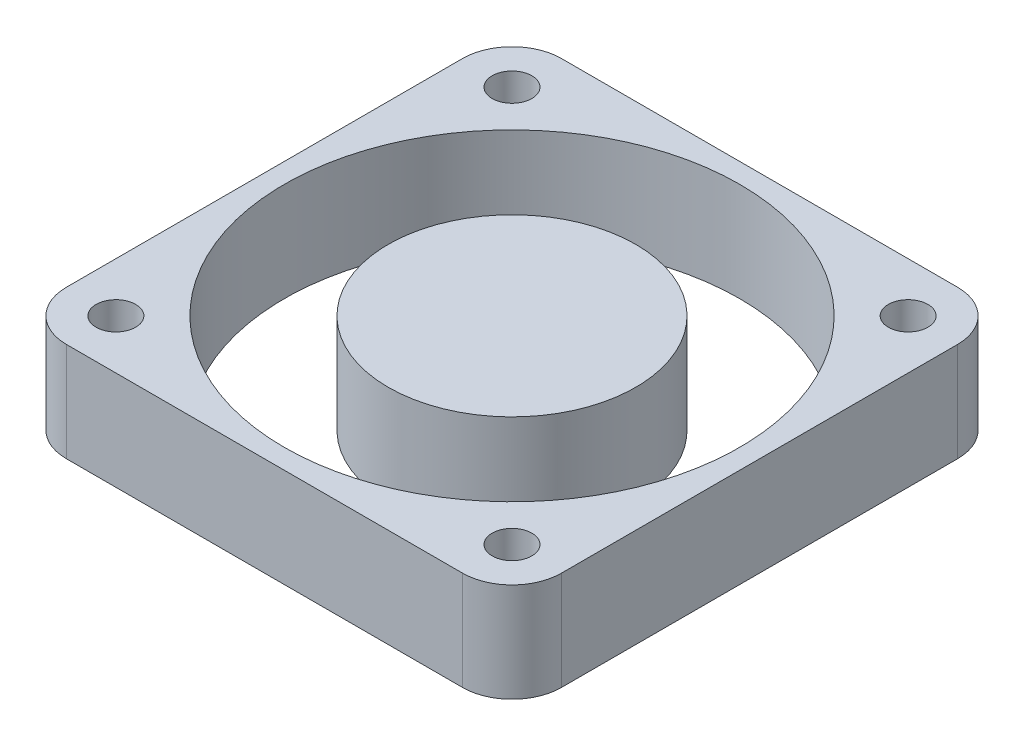
ISO-10303-21;
HEADER;
FILE_DESCRIPTION(('STEP AP214'),'2;1');
FILE_NAME('part.step','',(''),(''),'','','');
FILE_SCHEMA(('AUTOMOTIVE_DESIGN { 1 0 10303 214 1 1 1 1 }'));
ENDSEC;
DATA;
#1=APPLICATION_CONTEXT('core data for automotive mechanical design processes');
#2=APPLICATION_PROTOCOL_DEFINITION('international standard','automotive_design',2000,#1);
#3=PRODUCT_CONTEXT('',#1,'mechanical');
#4=PRODUCT('Part','Part','',(#3));
#5=PRODUCT_RELATED_PRODUCT_CATEGORY('part','',(#4));
#6=PRODUCT_DEFINITION_FORMATION('','',#4);
#7=PRODUCT_DEFINITION_CONTEXT('part definition',#1,'design');
#8=PRODUCT_DEFINITION('design','',#6,#7);
#9=PRODUCT_DEFINITION_SHAPE('','',#8);
#10=(LENGTH_UNIT() NAMED_UNIT(*) SI_UNIT(.MILLI.,.METRE.));
#11=(NAMED_UNIT(*) PLANE_ANGLE_UNIT() SI_UNIT($,.RADIAN.));
#12=(NAMED_UNIT(*) SI_UNIT($,.STERADIAN.) SOLID_ANGLE_UNIT());
#13=UNCERTAINTY_MEASURE_WITH_UNIT(LENGTH_MEASURE(1.E-05),#10,'distance_accuracy_value','');
#14=(GEOMETRIC_REPRESENTATION_CONTEXT(3) GLOBAL_UNCERTAINTY_ASSIGNED_CONTEXT((#13)) GLOBAL_UNIT_ASSIGNED_CONTEXT((#10,
#11,#12)) REPRESENTATION_CONTEXT('',''));
#15=CARTESIAN_POINT('',(0.,0.,0.));
#16=DIRECTION('',(0.,0.,1.));
#17=DIRECTION('',(1.,0.,0.));
#18=AXIS2_PLACEMENT_3D('',#15,#16,#17);
#19=CARTESIAN_POINT('',(20.,10.,-20.));
#20=DIRECTION('',(0.,-1.,0.));
#21=DIRECTION('',(0.,0.,-1.));
#22=AXIS2_PLACEMENT_3D('',#19,#20,#21);
#23=CYLINDRICAL_SURFACE('',#22,5.);
#24=CARTESIAN_POINT('',(20.,0.,-20.));
#25=DIRECTION('',(0.,1.,0.));
#26=DIRECTION('',(0.,0.,1.));
#27=AXIS2_PLACEMENT_3D('',#24,#25,#26);
#28=CIRCLE('',#27,5.);
#29=CARTESIAN_POINT('',(25.,0.,-20.));
#30=VERTEX_POINT('',#29);
#31=CARTESIAN_POINT('',(20.,0.,-25.));
#32=VERTEX_POINT('',#31);
#33=EDGE_CURVE('E137',#30,#32,#28,.T.);
#34=ORIENTED_EDGE('',*,*,#33,.T.);
#35=DIRECTION('',(0.,-1.,0.));
#36=VECTOR('',#35,1.);
#37=CARTESIAN_POINT('',(20.,10.,-25.));
#38=LINE('',#37,#36);
#39=CARTESIAN_POINT('',(20.,10.,-25.));
#40=VERTEX_POINT('',#39);
#41=EDGE_CURVE('E121',#40,#32,#38,.T.);
#42=ORIENTED_EDGE('',*,*,#41,.F.);
#43=CARTESIAN_POINT('',(20.,10.,-20.));
#44=DIRECTION('',(0.,1.,0.));
#45=DIRECTION('',(0.,0.,1.));
#46=AXIS2_PLACEMENT_3D('',#43,#44,#45);
#47=CIRCLE('',#46,5.);
#48=CARTESIAN_POINT('',(25.,10.,-20.));
#49=VERTEX_POINT('',#48);
#50=EDGE_CURVE('E45',#49,#40,#47,.T.);
#51=ORIENTED_EDGE('',*,*,#50,.F.);
#52=DIRECTION('',(0.,-1.,0.));
#53=VECTOR('',#52,1.);
#54=CARTESIAN_POINT('',(25.,10.,-20.));
#55=LINE('',#54,#53);
#56=EDGE_CURVE('E123',#49,#30,#55,.T.);
#57=ORIENTED_EDGE('',*,*,#56,.T.);
#58=EDGE_LOOP('',(#34,#42,#51,#57));
#59=FACE_BOUND('',#58,.T.);
#60=ADVANCED_FACE('F41',(#59),#23,.T.);
#61=CARTESIAN_POINT('',(-20.,10.,-25.));
#62=DIRECTION('',(0.,0.,1.));
#63=DIRECTION('',(1.,0.,0.));
#64=AXIS2_PLACEMENT_3D('',#61,#62,#63);
#65=PLANE('',#64);
#66=DIRECTION('',(-1.,0.,0.));
#67=VECTOR('',#66,1.);
#68=CARTESIAN_POINT('',(-20.,0.,-25.));
#69=LINE('',#68,#67);
#70=CARTESIAN_POINT('',(-20.,0.,-25.));
#71=VERTEX_POINT('',#70);
#72=EDGE_CURVE('E60',#32,#71,#69,.T.);
#73=ORIENTED_EDGE('',*,*,#72,.T.);
#74=DIRECTION('',(0.,-1.,0.));
#75=VECTOR('',#74,1.);
#76=CARTESIAN_POINT('',(-20.,10.,-25.));
#77=LINE('',#76,#75);
#78=CARTESIAN_POINT('',(-20.,10.,-25.));
#79=VERTEX_POINT('',#78);
#80=EDGE_CURVE('E118',#79,#71,#77,.T.);
#81=ORIENTED_EDGE('',*,*,#80,.F.);
#82=DIRECTION('',(-1.,0.,0.));
#83=VECTOR('',#82,1.);
#84=CARTESIAN_POINT('',(-20.,10.,-25.));
#85=LINE('',#84,#83);
#86=EDGE_CURVE('E87',#40,#79,#85,.T.);
#87=ORIENTED_EDGE('',*,*,#86,.F.);
#88=ORIENTED_EDGE('',*,*,#41,.T.);
#89=EDGE_LOOP('',(#73,#81,#87,#88));
#90=FACE_BOUND('',#89,.T.);
#91=ADVANCED_FACE('F117',(#90),#65,.F.);
#92=CARTESIAN_POINT('',(-20.,10.,-20.));
#93=DIRECTION('',(0.,-1.,0.));
#94=DIRECTION('',(0.,0.,-1.));
#95=AXIS2_PLACEMENT_3D('',#92,#93,#94);
#96=CYLINDRICAL_SURFACE('',#95,5.);
#97=CARTESIAN_POINT('',(-20.,0.,-20.));
#98=DIRECTION('',(0.,1.,0.));
#99=DIRECTION('',(0.,0.,-1.));
#100=AXIS2_PLACEMENT_3D('',#97,#98,#99);
#101=CIRCLE('',#100,5.);
#102=CARTESIAN_POINT('',(-25.,0.,-20.));
#103=VERTEX_POINT('',#102);
#104=EDGE_CURVE('E114',#71,#103,#101,.T.);
#105=ORIENTED_EDGE('',*,*,#104,.T.);
#106=DIRECTION('',(0.,-1.,0.));
#107=VECTOR('',#106,1.);
#108=CARTESIAN_POINT('',(-25.,10.,-20.));
#109=LINE('',#108,#107);
#110=CARTESIAN_POINT('',(-25.,10.,-20.));
#111=VERTEX_POINT('',#110);
#112=EDGE_CURVE('E164',#111,#103,#109,.T.);
#113=ORIENTED_EDGE('',*,*,#112,.F.);
#114=CARTESIAN_POINT('',(-20.,10.,-20.));
#115=DIRECTION('',(0.,1.,0.));
#116=DIRECTION('',(0.,0.,-1.));
#117=AXIS2_PLACEMENT_3D('',#114,#115,#116);
#118=CIRCLE('',#117,5.);
#119=EDGE_CURVE('E126',#79,#111,#118,.T.);
#120=ORIENTED_EDGE('',*,*,#119,.F.);
#121=ORIENTED_EDGE('',*,*,#80,.T.);
#122=EDGE_LOOP('',(#105,#113,#120,#121));
#123=FACE_BOUND('',#122,.T.);
#124=ADVANCED_FACE('F125',(#123),#96,.T.);
#125=CARTESIAN_POINT('',(-25.,10.,-20.));
#126=DIRECTION('',(1.,0.,0.));
#127=DIRECTION('',(0.,0.,-1.));
#128=AXIS2_PLACEMENT_3D('',#125,#126,#127);
#129=PLANE('',#128);
#130=DIRECTION('',(0.,0.,1.));
#131=VECTOR('',#130,1.);
#132=CARTESIAN_POINT('',(-25.,0.,-20.));
#133=LINE('',#132,#131);
#134=CARTESIAN_POINT('',(-25.,0.,20.));
#135=VERTEX_POINT('',#134);
#136=EDGE_CURVE('E127',#103,#135,#133,.T.);
#137=ORIENTED_EDGE('',*,*,#136,.T.);
#138=DIRECTION('',(0.,-1.,0.));
#139=VECTOR('',#138,1.);
#140=CARTESIAN_POINT('',(-25.,10.,20.));
#141=LINE('',#140,#139);
#142=CARTESIAN_POINT('',(-25.,10.,20.));
#143=VERTEX_POINT('',#142);
#144=EDGE_CURVE('E162',#143,#135,#141,.T.);
#145=ORIENTED_EDGE('',*,*,#144,.F.);
#146=DIRECTION('',(0.,0.,1.));
#147=VECTOR('',#146,1.);
#148=CARTESIAN_POINT('',(-25.,10.,-20.));
#149=LINE('',#148,#147);
#150=EDGE_CURVE('E145',#111,#143,#149,.T.);
#151=ORIENTED_EDGE('',*,*,#150,.F.);
#152=ORIENTED_EDGE('',*,*,#112,.T.);
#153=EDGE_LOOP('',(#137,#145,#151,#152));
#154=FACE_BOUND('',#153,.T.);
#155=ADVANCED_FACE('F186',(#154),#129,.F.);
#156=CARTESIAN_POINT('',(-20.,10.,20.));
#157=DIRECTION('',(0.,-1.,0.));
#158=DIRECTION('',(0.,0.,-1.));
#159=AXIS2_PLACEMENT_3D('',#156,#157,#158);
#160=CYLINDRICAL_SURFACE('',#159,5.);
#161=CARTESIAN_POINT('',(-20.,0.,20.));
#162=DIRECTION('',(0.,1.,0.));
#163=DIRECTION('',(0.,0.,-1.));
#164=AXIS2_PLACEMENT_3D('',#161,#162,#163);
#165=CIRCLE('',#164,5.);
#166=CARTESIAN_POINT('',(-20.,0.,25.));
#167=VERTEX_POINT('',#166);
#168=EDGE_CURVE('E163',#135,#167,#165,.T.);
#169=ORIENTED_EDGE('',*,*,#168,.T.);
#170=DIRECTION('',(0.,-1.,0.));
#171=VECTOR('',#170,1.);
#172=CARTESIAN_POINT('',(-20.,10.,25.));
#173=LINE('',#172,#171);
#174=CARTESIAN_POINT('',(-20.,10.,25.));
#175=VERTEX_POINT('',#174);
#176=EDGE_CURVE('E160',#175,#167,#173,.T.);
#177=ORIENTED_EDGE('',*,*,#176,.F.);
#178=CARTESIAN_POINT('',(-20.,10.,20.));
#179=DIRECTION('',(0.,1.,0.));
#180=DIRECTION('',(0.,0.,-1.));
#181=AXIS2_PLACEMENT_3D('',#178,#179,#180);
#182=CIRCLE('',#181,5.);
#183=EDGE_CURVE('E143',#143,#175,#182,.T.);
#184=ORIENTED_EDGE('',*,*,#183,.F.);
#185=ORIENTED_EDGE('',*,*,#144,.T.);
#186=EDGE_LOOP('',(#169,#177,#184,#185));
#187=FACE_BOUND('',#186,.T.);
#188=ADVANCED_FACE('F185',(#187),#160,.T.);
#189=CARTESIAN_POINT('',(-20.,10.,25.));
#190=DIRECTION('',(0.,0.,-1.));
#191=DIRECTION('',(-1.,0.,0.));
#192=AXIS2_PLACEMENT_3D('',#189,#190,#191);
#193=PLANE('',#192);
#194=DIRECTION('',(1.,0.,0.));
#195=VECTOR('',#194,1.);
#196=CARTESIAN_POINT('',(-20.,0.,25.));
#197=LINE('',#196,#195);
#198=CARTESIAN_POINT('',(20.,0.,25.));
#199=VERTEX_POINT('',#198);
#200=EDGE_CURVE('E161',#167,#199,#197,.T.);
#201=ORIENTED_EDGE('',*,*,#200,.T.);
#202=DIRECTION('',(0.,-1.,0.));
#203=VECTOR('',#202,1.);
#204=CARTESIAN_POINT('',(20.,10.,25.));
#205=LINE('',#204,#203);
#206=CARTESIAN_POINT('',(20.,10.,25.));
#207=VERTEX_POINT('',#206);
#208=EDGE_CURVE('E152',#207,#199,#205,.T.);
#209=ORIENTED_EDGE('',*,*,#208,.F.);
#210=DIRECTION('',(1.,0.,0.));
#211=VECTOR('',#210,1.);
#212=CARTESIAN_POINT('',(-20.,10.,25.));
#213=LINE('',#212,#211);
#214=EDGE_CURVE('E141',#175,#207,#213,.T.);
#215=ORIENTED_EDGE('',*,*,#214,.F.);
#216=ORIENTED_EDGE('',*,*,#176,.T.);
#217=EDGE_LOOP('',(#201,#209,#215,#216));
#218=FACE_BOUND('',#217,.T.);
#219=ADVANCED_FACE('F176',(#218),#193,.F.);
#220=CARTESIAN_POINT('',(20.,10.,20.));
#221=DIRECTION('',(0.,-1.,0.));
#222=DIRECTION('',(0.,0.,-1.));
#223=AXIS2_PLACEMENT_3D('',#220,#221,#222);
#224=CYLINDRICAL_SURFACE('',#223,5.);
#225=CARTESIAN_POINT('',(20.,0.,20.));
#226=DIRECTION('',(0.,1.,0.));
#227=DIRECTION('',(0.,0.,-1.));
#228=AXIS2_PLACEMENT_3D('',#225,#226,#227);
#229=CIRCLE('',#228,5.);
#230=CARTESIAN_POINT('',(25.,0.,20.));
#231=VERTEX_POINT('',#230);
#232=EDGE_CURVE('E158',#199,#231,#229,.T.);
#233=ORIENTED_EDGE('',*,*,#232,.T.);
#234=DIRECTION('',(0.,-1.,0.));
#235=VECTOR('',#234,1.);
#236=CARTESIAN_POINT('',(25.,10.,20.));
#237=LINE('',#236,#235);
#238=CARTESIAN_POINT('',(25.,10.,20.));
#239=VERTEX_POINT('',#238);
#240=EDGE_CURVE('E147',#239,#231,#237,.T.);
#241=ORIENTED_EDGE('',*,*,#240,.F.);
#242=CARTESIAN_POINT('',(20.,10.,20.));
#243=DIRECTION('',(0.,1.,0.));
#244=DIRECTION('',(0.,0.,-1.));
#245=AXIS2_PLACEMENT_3D('',#242,#243,#244);
#246=CIRCLE('',#245,5.);
#247=EDGE_CURVE('E51',#207,#239,#246,.T.);
#248=ORIENTED_EDGE('',*,*,#247,.F.);
#249=ORIENTED_EDGE('',*,*,#208,.T.);
#250=EDGE_LOOP('',(#233,#241,#248,#249));
#251=FACE_BOUND('',#250,.T.);
#252=ADVANCED_FACE('F182',(#251),#224,.T.);
#253=CARTESIAN_POINT('',(25.,10.,-20.));
#254=DIRECTION('',(-1.,0.,0.));
#255=DIRECTION('',(0.,0.,1.));
#256=AXIS2_PLACEMENT_3D('',#253,#254,#255);
#257=PLANE('',#256);
#258=DIRECTION('',(0.,0.,-1.));
#259=VECTOR('',#258,1.);
#260=CARTESIAN_POINT('',(25.,0.,-20.));
#261=LINE('',#260,#259);
#262=EDGE_CURVE('E96',#231,#30,#261,.T.);
#263=ORIENTED_EDGE('',*,*,#262,.T.);
#264=ORIENTED_EDGE('',*,*,#56,.F.);
#265=DIRECTION('',(0.,0.,-1.));
#266=VECTOR('',#265,1.);
#267=CARTESIAN_POINT('',(25.,10.,-20.));
#268=LINE('',#267,#266);
#269=EDGE_CURVE('E12',#239,#49,#268,.T.);
#270=ORIENTED_EDGE('',*,*,#269,.F.);
#271=ORIENTED_EDGE('',*,*,#240,.T.);
#272=EDGE_LOOP('',(#263,#264,#270,#271));
#273=FACE_BOUND('',#272,.T.);
#274=ADVANCED_FACE('F265',(#273),#257,.F.);
#275=CARTESIAN_POINT('',(20.,10.,-20.));
#276=DIRECTION('',(0.,1.,0.));
#277=DIRECTION('',(0.,0.,1.));
#278=AXIS2_PLACEMENT_3D('',#275,#276,#277);
#279=PLANE('',#278);
#280=CARTESIAN_POINT('',(-20.,10.,-20.));
#281=DIRECTION('',(0.,1.,0.));
#282=DIRECTION('',(0.,0.,-1.));
#283=AXIS2_PLACEMENT_3D('',#280,#281,#282);
#284=CIRCLE('',#283,2.00000000000001);
#285=CARTESIAN_POINT('',(-20.,10.,-22.));
#286=VERTEX_POINT('',#285);
#287=EDGE_CURVE('E230',#286,#286,#284,.T.);
#288=ORIENTED_EDGE('',*,*,#287,.F.);
#289=EDGE_LOOP('',(#288));
#290=FACE_BOUND('',#289,.T.);
#291=CARTESIAN_POINT('',(-20.,10.,20.));
#292=DIRECTION('',(0.,1.,0.));
#293=DIRECTION('',(0.,0.,1.));
#294=AXIS2_PLACEMENT_3D('',#291,#292,#293);
#295=CIRCLE('',#294,2.00000000000001);
#296=CARTESIAN_POINT('',(-20.,10.,22.));
#297=VERTEX_POINT('',#296);
#298=EDGE_CURVE('E233',#297,#297,#295,.T.);
#299=ORIENTED_EDGE('',*,*,#298,.F.);
#300=EDGE_LOOP('',(#299));
#301=FACE_BOUND('',#300,.T.);
#302=CARTESIAN_POINT('',(20.,10.,20.));
#303=DIRECTION('',(0.,1.,0.));
#304=DIRECTION('',(0.,0.,-1.));
#305=AXIS2_PLACEMENT_3D('',#302,#303,#304);
#306=CIRCLE('',#305,2.00000000000001);
#307=CARTESIAN_POINT('',(20.,10.,18.));
#308=VERTEX_POINT('',#307);
#309=EDGE_CURVE('E241',#308,#308,#306,.T.);
#310=ORIENTED_EDGE('',*,*,#309,.F.);
#311=EDGE_LOOP('',(#310));
#312=FACE_BOUND('',#311,.T.);
#313=CARTESIAN_POINT('',(20.,10.,-20.));
#314=DIRECTION('',(0.,1.,0.));
#315=DIRECTION('',(0.,0.,1.));
#316=AXIS2_PLACEMENT_3D('',#313,#314,#315);
#317=CIRCLE('',#316,2.00000000000001);
#318=CARTESIAN_POINT('',(20.,10.,-18.));
#319=VERTEX_POINT('',#318);
#320=EDGE_CURVE('E247',#319,#319,#317,.T.);
#321=ORIENTED_EDGE('',*,*,#320,.F.);
#322=EDGE_LOOP('',(#321));
#323=FACE_BOUND('',#322,.T.);
#324=CARTESIAN_POINT('',(0.,10.,0.));
#325=DIRECTION('',(0.,1.,0.));
#326=DIRECTION('',(0.,0.,1.));
#327=AXIS2_PLACEMENT_3D('',#324,#325,#326);
#328=CIRCLE('',#327,23.);
#329=CARTESIAN_POINT('',(0.,10.,23.));
#330=VERTEX_POINT('',#329);
#331=EDGE_CURVE('E253',#330,#330,#328,.T.);
#332=ORIENTED_EDGE('',*,*,#331,.F.);
#333=EDGE_LOOP('',(#332));
#334=FACE_BOUND('',#333,.T.);
#335=ORIENTED_EDGE('',*,*,#50,.T.);
#336=ORIENTED_EDGE('',*,*,#86,.T.);
#337=ORIENTED_EDGE('',*,*,#119,.T.);
#338=ORIENTED_EDGE('',*,*,#150,.T.);
#339=ORIENTED_EDGE('',*,*,#183,.T.);
#340=ORIENTED_EDGE('',*,*,#214,.T.);
#341=ORIENTED_EDGE('',*,*,#247,.T.);
#342=ORIENTED_EDGE('',*,*,#269,.T.);
#343=EDGE_LOOP('',(#335,#336,#337,#338,#339,#340,#341,#342));
#344=FACE_BOUND('',#343,.T.);
#345=ADVANCED_FACE('F43',(#290,#301,#312,#323,#334,#344),#279,.T.);
#346=CARTESIAN_POINT('',(20.,0.,-20.));
#347=DIRECTION('',(0.,1.,0.));
#348=DIRECTION('',(0.,0.,1.));
#349=AXIS2_PLACEMENT_3D('',#346,#347,#348);
#350=PLANE('',#349);
#351=CARTESIAN_POINT('',(-20.,0.,-20.));
#352=DIRECTION('',(0.,1.,0.));
#353=DIRECTION('',(0.,0.,1.));
#354=AXIS2_PLACEMENT_3D('',#351,#352,#353);
#355=CIRCLE('',#354,2.00000000000001);
#356=CARTESIAN_POINT('',(-20.,0.,-18.));
#357=VERTEX_POINT('',#356);
#358=EDGE_CURVE('E227',#357,#357,#355,.F.);
#359=ORIENTED_EDGE('',*,*,#358,.F.);
#360=EDGE_LOOP('',(#359));
#361=FACE_BOUND('',#360,.T.);
#362=CARTESIAN_POINT('',(-20.,0.,20.));
#363=DIRECTION('',(0.,1.,0.));
#364=DIRECTION('',(0.,0.,1.));
#365=AXIS2_PLACEMENT_3D('',#362,#363,#364);
#366=CIRCLE('',#365,2.00000000000001);
#367=CARTESIAN_POINT('',(-20.,0.,22.));
#368=VERTEX_POINT('',#367);
#369=EDGE_CURVE('E238',#368,#368,#366,.F.);
#370=ORIENTED_EDGE('',*,*,#369,.F.);
#371=EDGE_LOOP('',(#370));
#372=FACE_BOUND('',#371,.T.);
#373=CARTESIAN_POINT('',(20.,0.,20.));
#374=DIRECTION('',(0.,1.,0.));
#375=DIRECTION('',(0.,0.,1.));
#376=AXIS2_PLACEMENT_3D('',#373,#374,#375);
#377=CIRCLE('',#376,2.00000000000001);
#378=CARTESIAN_POINT('',(20.,0.,22.));
#379=VERTEX_POINT('',#378);
#380=EDGE_CURVE('E244',#379,#379,#377,.F.);
#381=ORIENTED_EDGE('',*,*,#380,.F.);
#382=EDGE_LOOP('',(#381));
#383=FACE_BOUND('',#382,.T.);
#384=CARTESIAN_POINT('',(20.,0.,-20.));
#385=DIRECTION('',(0.,1.,0.));
#386=DIRECTION('',(0.,0.,1.));
#387=AXIS2_PLACEMENT_3D('',#384,#385,#386);
#388=CIRCLE('',#387,2.00000000000001);
#389=CARTESIAN_POINT('',(20.,0.,-18.));
#390=VERTEX_POINT('',#389);
#391=EDGE_CURVE('E250',#390,#390,#388,.F.);
#392=ORIENTED_EDGE('',*,*,#391,.F.);
#393=EDGE_LOOP('',(#392));
#394=FACE_BOUND('',#393,.T.);
#395=CARTESIAN_POINT('',(0.,0.,0.));
#396=DIRECTION('',(0.,1.,0.));
#397=DIRECTION('',(0.,0.,1.));
#398=AXIS2_PLACEMENT_3D('',#395,#396,#397);
#399=CIRCLE('',#398,23.);
#400=CARTESIAN_POINT('',(0.,0.,23.));
#401=VERTEX_POINT('',#400);
#402=EDGE_CURVE('E138',#401,#401,#399,.F.);
#403=ORIENTED_EDGE('',*,*,#402,.F.);
#404=EDGE_LOOP('',(#403));
#405=FACE_BOUND('',#404,.T.);
#406=ORIENTED_EDGE('',*,*,#33,.F.);
#407=ORIENTED_EDGE('',*,*,#262,.F.);
#408=ORIENTED_EDGE('',*,*,#232,.F.);
#409=ORIENTED_EDGE('',*,*,#200,.F.);
#410=ORIENTED_EDGE('',*,*,#168,.F.);
#411=ORIENTED_EDGE('',*,*,#136,.F.);
#412=ORIENTED_EDGE('',*,*,#104,.F.);
#413=ORIENTED_EDGE('',*,*,#72,.F.);
#414=EDGE_LOOP('',(#406,#407,#408,#409,#410,#411,#412,#413));
#415=FACE_BOUND('',#414,.T.);
#416=ADVANCED_FACE('F130',(#361,#372,#383,#394,#405,#415),#350,.F.);
#417=CARTESIAN_POINT('',(0.,-70.7106781186548,0.));
#418=DIRECTION('',(0.,1.,0.));
#419=DIRECTION('',(0.,0.,1.));
#420=AXIS2_PLACEMENT_3D('',#417,#418,#419);
#421=CYLINDRICAL_SURFACE('',#420,23.);
#422=ORIENTED_EDGE('',*,*,#331,.T.);
#423=EDGE_LOOP('',(#422));
#424=FACE_BOUND('',#423,.T.);
#425=ORIENTED_EDGE('',*,*,#402,.T.);
#426=EDGE_LOOP('',(#425));
#427=FACE_BOUND('',#426,.T.);
#428=ADVANCED_FACE('F203',(#424,#427),#421,.F.);
#429=CARTESIAN_POINT('',(20.,-5.6568542494924,-20.));
#430=DIRECTION('',(0.,1.,0.));
#431=DIRECTION('',(0.,0.,1.));
#432=AXIS2_PLACEMENT_3D('',#429,#430,#431);
#433=CYLINDRICAL_SURFACE('',#432,2.00000000000001);
#434=ORIENTED_EDGE('',*,*,#391,.T.);
#435=EDGE_LOOP('',(#434));
#436=FACE_BOUND('',#435,.T.);
#437=ORIENTED_EDGE('',*,*,#320,.T.);
#438=EDGE_LOOP('',(#437));
#439=FACE_BOUND('',#438,.T.);
#440=ADVANCED_FACE('F206',(#436,#439),#433,.F.);
#441=CARTESIAN_POINT('',(20.,-5.6568542494924,20.));
#442=DIRECTION('',(0.,1.,0.));
#443=DIRECTION('',(0.,0.,1.));
#444=AXIS2_PLACEMENT_3D('',#441,#442,#443);
#445=CYLINDRICAL_SURFACE('',#444,2.00000000000001);
#446=ORIENTED_EDGE('',*,*,#380,.T.);
#447=EDGE_LOOP('',(#446));
#448=FACE_BOUND('',#447,.T.);
#449=ORIENTED_EDGE('',*,*,#309,.T.);
#450=EDGE_LOOP('',(#449));
#451=FACE_BOUND('',#450,.T.);
#452=ADVANCED_FACE('F210',(#448,#451),#445,.F.);
#453=CARTESIAN_POINT('',(-20.,-5.6568542494924,20.));
#454=DIRECTION('',(0.,1.,0.));
#455=DIRECTION('',(0.,0.,1.));
#456=AXIS2_PLACEMENT_3D('',#453,#454,#455);
#457=CYLINDRICAL_SURFACE('',#456,2.00000000000001);
#458=ORIENTED_EDGE('',*,*,#369,.T.);
#459=EDGE_LOOP('',(#458));
#460=FACE_BOUND('',#459,.T.);
#461=ORIENTED_EDGE('',*,*,#298,.T.);
#462=EDGE_LOOP('',(#461));
#463=FACE_BOUND('',#462,.T.);
#464=ADVANCED_FACE('F214',(#460,#463),#457,.F.);
#465=CARTESIAN_POINT('',(-20.,-5.6568542494924,-20.));
#466=DIRECTION('',(0.,1.,0.));
#467=DIRECTION('',(0.,0.,1.));
#468=AXIS2_PLACEMENT_3D('',#465,#466,#467);
#469=CYLINDRICAL_SURFACE('',#468,2.00000000000001);
#470=ORIENTED_EDGE('',*,*,#358,.T.);
#471=EDGE_LOOP('',(#470));
#472=FACE_BOUND('',#471,.T.);
#473=ORIENTED_EDGE('',*,*,#287,.T.);
#474=EDGE_LOOP('',(#473));
#475=FACE_BOUND('',#474,.T.);
#476=ADVANCED_FACE('F218',(#472,#475),#469,.F.);
#477=CLOSED_SHELL('',(#60,#91,#124,#155,#188,#219,#252,#274,#345,#416,#428,#440,#452,#464,#476));
#478=MANIFOLD_SOLID_BREP('B2',#477);
#479=CARTESIAN_POINT('',(20.,0.,-20.));
#480=DIRECTION('',(0.,1.,0.));
#481=DIRECTION('',(0.,0.,1.));
#482=AXIS2_PLACEMENT_3D('',#479,#480,#481);
#483=PLANE('',#482);
#484=CARTESIAN_POINT('',(0.,0.,0.));
#485=DIRECTION('',(0.,1.,0.));
#486=DIRECTION('',(0.,0.,1.));
#487=AXIS2_PLACEMENT_3D('',#484,#485,#486);
#488=CIRCLE('',#487,12.5);
#489=CARTESIAN_POINT('',(0.,0.,12.5));
#490=VERTEX_POINT('',#489);
#491=EDGE_CURVE('E40',#490,#490,#488,.T.);
#492=ORIENTED_EDGE('',*,*,#491,.F.);
#493=EDGE_LOOP('',(#492));
#494=FACE_BOUND('',#493,.T.);
#495=ADVANCED_FACE('F380',(#494),#483,.F.);
#496=CARTESIAN_POINT('',(0.,-7.,0.));
#497=DIRECTION('',(0.,1.,0.));
#498=DIRECTION('',(0.,0.,1.));
#499=AXIS2_PLACEMENT_3D('',#496,#497,#498);
#500=CYLINDRICAL_SURFACE('',#499,12.5);
#501=CARTESIAN_POINT('',(0.,10.,0.));
#502=DIRECTION('',(0.,1.,0.));
#503=DIRECTION('',(0.,0.,1.));
#504=AXIS2_PLACEMENT_3D('',#501,#502,#503);
#505=CIRCLE('',#504,12.5);
#506=CARTESIAN_POINT('',(0.,10.,12.5));
#507=VERTEX_POINT('',#506);
#508=EDGE_CURVE('E386',#507,#507,#505,.T.);
#509=ORIENTED_EDGE('',*,*,#508,.F.);
#510=EDGE_LOOP('',(#509));
#511=FACE_BOUND('',#510,.T.);
#512=ORIENTED_EDGE('',*,*,#491,.T.);
#513=EDGE_LOOP('',(#512));
#514=FACE_BOUND('',#513,.T.);
#515=ADVANCED_FACE('F394',(#511,#514),#500,.T.);
#516=CARTESIAN_POINT('',(20.,10.,-20.));
#517=DIRECTION('',(0.,1.,0.));
#518=DIRECTION('',(0.,0.,1.));
#519=AXIS2_PLACEMENT_3D('',#516,#517,#518);
#520=PLANE('',#519);
#521=ORIENTED_EDGE('',*,*,#508,.T.);
#522=EDGE_LOOP('',(#521));
#523=FACE_BOUND('',#522,.T.);
#524=ADVANCED_FACE('F392',(#523),#520,.T.);
#525=CLOSED_SHELL('',(#495,#515,#524));
#526=MANIFOLD_SOLID_BREP('B6',#525);
#527=ADVANCED_BREP_SHAPE_REPRESENTATION('',(#18,#478,#526),#14);
#528=SHAPE_DEFINITION_REPRESENTATION(#9,#527);
ENDSEC;
END-ISO-10303-21;
